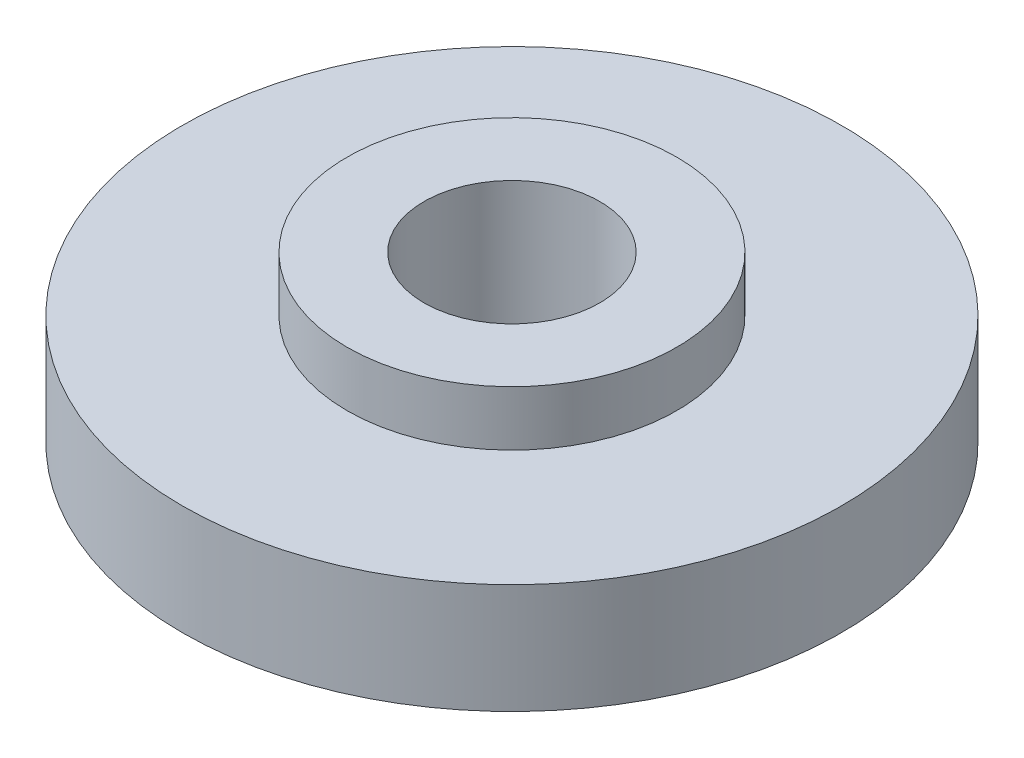
ISO-10303-21;
HEADER;
FILE_DESCRIPTION(('STEP AP214'),'2;1');
FILE_NAME('part.step','',(''),(''),'','','');
FILE_SCHEMA(('AUTOMOTIVE_DESIGN { 1 0 10303 214 1 1 1 1 }'));
ENDSEC;
DATA;
#1=APPLICATION_CONTEXT('core data for automotive mechanical design processes');
#2=APPLICATION_PROTOCOL_DEFINITION('international standard','automotive_design',2000,#1);
#3=PRODUCT_CONTEXT('',#1,'mechanical');
#4=PRODUCT('Part','Part','',(#3));
#5=PRODUCT_RELATED_PRODUCT_CATEGORY('part','',(#4));
#6=PRODUCT_DEFINITION_FORMATION('','',#4);
#7=PRODUCT_DEFINITION_CONTEXT('part definition',#1,'design');
#8=PRODUCT_DEFINITION('design','',#6,#7);
#9=PRODUCT_DEFINITION_SHAPE('','',#8);
#10=(LENGTH_UNIT() NAMED_UNIT(*) SI_UNIT(.MILLI.,.METRE.));
#11=(NAMED_UNIT(*) PLANE_ANGLE_UNIT() SI_UNIT($,.RADIAN.));
#12=(NAMED_UNIT(*) SI_UNIT($,.STERADIAN.) SOLID_ANGLE_UNIT());
#13=UNCERTAINTY_MEASURE_WITH_UNIT(LENGTH_MEASURE(1.E-05),#10,'distance_accuracy_value','');
#14=(GEOMETRIC_REPRESENTATION_CONTEXT(3) GLOBAL_UNCERTAINTY_ASSIGNED_CONTEXT((#13)) GLOBAL_UNIT_ASSIGNED_CONTEXT((#10,
#11,#12)) REPRESENTATION_CONTEXT('',''));
#15=CARTESIAN_POINT('',(0.,0.,0.));
#16=DIRECTION('',(0.,0.,1.));
#17=DIRECTION('',(1.,0.,0.));
#18=AXIS2_PLACEMENT_3D('',#15,#16,#17);
#19=CARTESIAN_POINT('',(0.,2.,0.));
#20=DIRECTION('',(0.,-1.,0.));
#21=DIRECTION('',(0.,0.,-1.));
#22=AXIS2_PLACEMENT_3D('',#19,#20,#21);
#23=CYLINDRICAL_SURFACE('',#22,6.);
#24=CARTESIAN_POINT('',(0.,2.,0.));
#25=DIRECTION('',(0.,1.,0.));
#26=DIRECTION('',(0.,0.,1.));
#27=AXIS2_PLACEMENT_3D('',#24,#25,#26);
#28=CIRCLE('',#27,6.);
#29=CARTESIAN_POINT('',(0.,2.,6.));
#30=VERTEX_POINT('',#29);
#31=EDGE_CURVE('E45',#30,#30,#28,.T.);
#32=ORIENTED_EDGE('',*,*,#31,.F.);
#33=EDGE_LOOP('',(#32));
#34=FACE_BOUND('',#33,.T.);
#35=CARTESIAN_POINT('',(0.,0.,0.));
#36=DIRECTION('',(0.,1.,0.));
#37=DIRECTION('',(0.,0.,1.));
#38=AXIS2_PLACEMENT_3D('',#35,#36,#37);
#39=CIRCLE('',#38,6.);
#40=CARTESIAN_POINT('',(0.,0.,6.));
#41=VERTEX_POINT('',#40);
#42=EDGE_CURVE('E40',#41,#41,#39,.T.);
#43=ORIENTED_EDGE('',*,*,#42,.T.);
#44=EDGE_LOOP('',(#43));
#45=FACE_BOUND('',#44,.T.);
#46=ADVANCED_FACE('F37',(#34,#45),#23,.T.);
#47=CARTESIAN_POINT('',(0.,2.,0.));
#48=DIRECTION('',(0.,1.,0.));
#49=DIRECTION('',(0.,0.,1.));
#50=AXIS2_PLACEMENT_3D('',#47,#48,#49);
#51=PLANE('',#50);
#52=CARTESIAN_POINT('',(0.,2.,0.));
#53=DIRECTION('',(0.,1.,0.));
#54=DIRECTION('',(0.,0.,1.));
#55=AXIS2_PLACEMENT_3D('',#52,#53,#54);
#56=CIRCLE('',#55,3.);
#57=CARTESIAN_POINT('',(0.,2.,3.));
#58=VERTEX_POINT('',#57);
#59=EDGE_CURVE('E10',#58,#58,#56,.T.);
#60=ORIENTED_EDGE('',*,*,#59,.F.);
#61=EDGE_LOOP('',(#60));
#62=FACE_BOUND('',#61,.T.);
#63=ORIENTED_EDGE('',*,*,#31,.T.);
#64=EDGE_LOOP('',(#63));
#65=FACE_BOUND('',#64,.T.);
#66=ADVANCED_FACE('F81',(#62,#65),#51,.T.);
#67=CARTESIAN_POINT('',(0.,0.,0.));
#68=DIRECTION('',(0.,1.,0.));
#69=DIRECTION('',(0.,0.,1.));
#70=AXIS2_PLACEMENT_3D('',#67,#68,#69);
#71=PLANE('',#70);
#72=CARTESIAN_POINT('',(0.,0.,0.));
#73=DIRECTION('',(0.,1.,0.));
#74=DIRECTION('',(0.,0.,1.));
#75=AXIS2_PLACEMENT_3D('',#72,#73,#74);
#76=CIRCLE('',#75,1.6);
#77=CARTESIAN_POINT('',(0.,0.,1.6));
#78=VERTEX_POINT('',#77);
#79=EDGE_CURVE('E56',#78,#78,#76,.T.);
#80=ORIENTED_EDGE('',*,*,#79,.T.);
#81=EDGE_LOOP('',(#80));
#82=FACE_BOUND('',#81,.T.);
#83=ORIENTED_EDGE('',*,*,#42,.F.);
#84=EDGE_LOOP('',(#83));
#85=FACE_BOUND('',#84,.T.);
#86=ADVANCED_FACE('F76',(#82,#85),#71,.F.);
#87=CARTESIAN_POINT('',(0.,3.,0.));
#88=DIRECTION('',(0.,-1.,0.));
#89=DIRECTION('',(0.,0.,-1.));
#90=AXIS2_PLACEMENT_3D('',#87,#88,#89);
#91=CYLINDRICAL_SURFACE('',#90,3.);
#92=CARTESIAN_POINT('',(0.,3.,0.));
#93=DIRECTION('',(0.,1.,0.));
#94=DIRECTION('',(0.,0.,1.));
#95=AXIS2_PLACEMENT_3D('',#92,#93,#94);
#96=CIRCLE('',#95,3.);
#97=CARTESIAN_POINT('',(0.,3.,3.));
#98=VERTEX_POINT('',#97);
#99=EDGE_CURVE('E52',#98,#98,#96,.T.);
#100=ORIENTED_EDGE('',*,*,#99,.F.);
#101=EDGE_LOOP('',(#100));
#102=FACE_BOUND('',#101,.T.);
#103=ORIENTED_EDGE('',*,*,#59,.T.);
#104=EDGE_LOOP('',(#103));
#105=FACE_BOUND('',#104,.T.);
#106=ADVANCED_FACE('F71',(#102,#105),#91,.T.);
#107=CARTESIAN_POINT('',(0.,3.,0.));
#108=DIRECTION('',(0.,1.,0.));
#109=DIRECTION('',(0.,0.,1.));
#110=AXIS2_PLACEMENT_3D('',#107,#108,#109);
#111=PLANE('',#110);
#112=CARTESIAN_POINT('',(0.,3.,0.));
#113=DIRECTION('',(0.,1.,0.));
#114=DIRECTION('',(0.,0.,1.));
#115=AXIS2_PLACEMENT_3D('',#112,#113,#114);
#116=CIRCLE('',#115,1.6);
#117=CARTESIAN_POINT('',(0.,3.,1.6));
#118=VERTEX_POINT('',#117);
#119=EDGE_CURVE('E60',#118,#118,#116,.T.);
#120=ORIENTED_EDGE('',*,*,#119,.F.);
#121=EDGE_LOOP('',(#120));
#122=FACE_BOUND('',#121,.T.);
#123=ORIENTED_EDGE('',*,*,#99,.T.);
#124=EDGE_LOOP('',(#123));
#125=FACE_BOUND('',#124,.T.);
#126=ADVANCED_FACE('F68',(#122,#125),#111,.T.);
#127=CARTESIAN_POINT('',(0.,-3.,0.));
#128=DIRECTION('',(0.,1.,0.));
#129=DIRECTION('',(0.,0.,1.));
#130=AXIS2_PLACEMENT_3D('',#127,#128,#129);
#131=CYLINDRICAL_SURFACE('',#130,1.6);
#132=ORIENTED_EDGE('',*,*,#119,.T.);
#133=EDGE_LOOP('',(#132));
#134=FACE_BOUND('',#133,.T.);
#135=ORIENTED_EDGE('',*,*,#79,.F.);
#136=EDGE_LOOP('',(#135));
#137=FACE_BOUND('',#136,.T.);
#138=ADVANCED_FACE('F65',(#134,#137),#131,.F.);
#139=CLOSED_SHELL('',(#46,#66,#86,#106,#126,#138));
#140=MANIFOLD_SOLID_BREP('B2',#139);
#141=ADVANCED_BREP_SHAPE_REPRESENTATION('',(#18,#140),#14);
#142=SHAPE_DEFINITION_REPRESENTATION(#9,#141);
ENDSEC;
END-ISO-10303-21;
